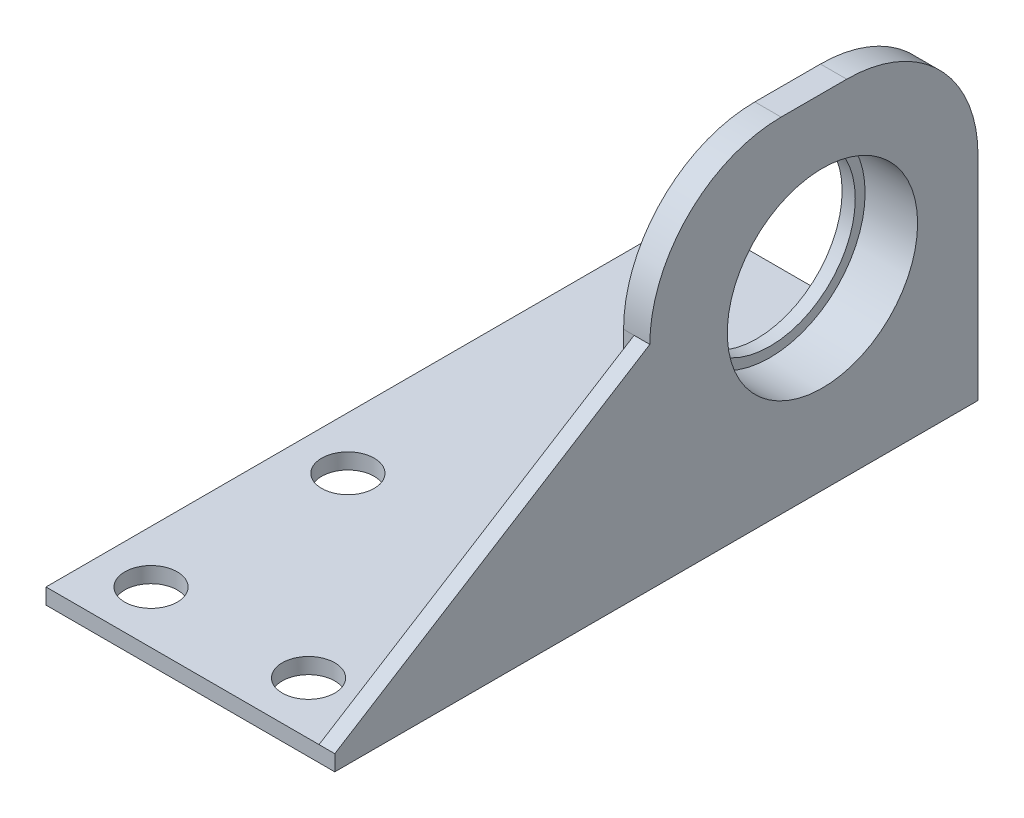
ISO-10303-21;
HEADER;
FILE_DESCRIPTION(('STEP AP214'),'2;1');
FILE_NAME('part.step','',(''),(''),'','','');
FILE_SCHEMA(('AUTOMOTIVE_DESIGN { 1 0 10303 214 1 1 1 1 }'));
ENDSEC;
DATA;
#1=APPLICATION_CONTEXT('core data for automotive mechanical design processes');
#2=APPLICATION_PROTOCOL_DEFINITION('international standard','automotive_design',2000,#1);
#3=PRODUCT_CONTEXT('',#1,'mechanical');
#4=PRODUCT('Part','Part','',(#3));
#5=PRODUCT_RELATED_PRODUCT_CATEGORY('part','',(#4));
#6=PRODUCT_DEFINITION_FORMATION('','',#4);
#7=PRODUCT_DEFINITION_CONTEXT('part definition',#1,'design');
#8=PRODUCT_DEFINITION('design','',#6,#7);
#9=PRODUCT_DEFINITION_SHAPE('','',#8);
#10=(LENGTH_UNIT() NAMED_UNIT(*) SI_UNIT(.MILLI.,.METRE.));
#11=(NAMED_UNIT(*) PLANE_ANGLE_UNIT() SI_UNIT($,.RADIAN.));
#12=(NAMED_UNIT(*) SI_UNIT($,.STERADIAN.) SOLID_ANGLE_UNIT());
#13=UNCERTAINTY_MEASURE_WITH_UNIT(LENGTH_MEASURE(1.E-05),#10,'distance_accuracy_value','');
#14=(GEOMETRIC_REPRESENTATION_CONTEXT(3) GLOBAL_UNCERTAINTY_ASSIGNED_CONTEXT((#13)) GLOBAL_UNIT_ASSIGNED_CONTEXT((#10,
#11,#12)) REPRESENTATION_CONTEXT('',''));
#15=CARTESIAN_POINT('',(0.,0.,0.));
#16=DIRECTION('',(0.,0.,1.));
#17=DIRECTION('',(1.,0.,0.));
#18=AXIS2_PLACEMENT_3D('',#15,#16,#17);
#19=CARTESIAN_POINT('',(22.,1.2,0.));
#20=DIRECTION('',(0.,-1.,0.));
#21=DIRECTION('',(0.,0.,-1.));
#22=AXIS2_PLACEMENT_3D('',#19,#20,#21);
#23=PLANE('',#22);
#24=CARTESIAN_POINT('',(16.,1.2,-4.));
#25=DIRECTION('',(0.,1.,0.));
#26=DIRECTION('',(0.,0.,-1.));
#27=AXIS2_PLACEMENT_3D('',#24,#25,#26);
#28=CIRCLE('',#27,2.);
#29=CARTESIAN_POINT('',(16.,1.2,-6.));
#30=VERTEX_POINT('',#29);
#31=EDGE_CURVE('E215',#30,#30,#28,.T.);
#32=ORIENTED_EDGE('',*,*,#31,.F.);
#33=EDGE_LOOP('',(#32));
#34=FACE_BOUND('',#33,.T.);
#35=CARTESIAN_POINT('',(4.00000000000001,1.2,-4.00000000000001));
#36=DIRECTION('',(0.,1.,0.));
#37=DIRECTION('',(0.,0.,1.));
#38=AXIS2_PLACEMENT_3D('',#35,#36,#37);
#39=CIRCLE('',#38,2.);
#40=CARTESIAN_POINT('',(4.00000000000001,1.2,-2.00000000000001));
#41=VERTEX_POINT('',#40);
#42=EDGE_CURVE('E224',#41,#41,#39,.T.);
#43=ORIENTED_EDGE('',*,*,#42,.F.);
#44=EDGE_LOOP('',(#43));
#45=FACE_BOUND('',#44,.T.);
#46=CARTESIAN_POINT('',(4.00000000000001,1.2,-19.));
#47=DIRECTION('',(0.,1.,0.));
#48=DIRECTION('',(0.,0.,-1.));
#49=AXIS2_PLACEMENT_3D('',#46,#47,#48);
#50=CIRCLE('',#49,2.);
#51=CARTESIAN_POINT('',(4.00000000000001,1.2,-21.));
#52=VERTEX_POINT('',#51);
#53=EDGE_CURVE('E216',#52,#52,#50,.T.);
#54=ORIENTED_EDGE('',*,*,#53,.F.);
#55=EDGE_LOOP('',(#54));
#56=FACE_BOUND('',#55,.T.);
#57=CARTESIAN_POINT('',(16.,1.2,-19.));
#58=DIRECTION('',(0.,1.,0.));
#59=DIRECTION('',(0.,0.,1.));
#60=AXIS2_PLACEMENT_3D('',#57,#58,#59);
#61=CIRCLE('',#60,2.);
#62=CARTESIAN_POINT('',(16.,1.2,-17.));
#63=VERTEX_POINT('',#62);
#64=EDGE_CURVE('E223',#63,#63,#61,.T.);
#65=ORIENTED_EDGE('',*,*,#64,.F.);
#66=EDGE_LOOP('',(#65));
#67=FACE_BOUND('',#66,.T.);
#68=DIRECTION('',(0.,0.,-1.));
#69=VECTOR('',#68,1.);
#70=CARTESIAN_POINT('',(20.8,1.2,-24.));
#71=LINE('',#70,#69);
#72=CARTESIAN_POINT('',(20.8,1.2,0.));
#73=VERTEX_POINT('',#72);
#74=CARTESIAN_POINT('',(20.8,1.2,-24.));
#75=VERTEX_POINT('',#74);
#76=EDGE_CURVE('E55',#73,#75,#71,.T.);
#77=ORIENTED_EDGE('',*,*,#76,.T.);
#78=DIRECTION('',(1.,0.,0.));
#79=VECTOR('',#78,1.);
#80=CARTESIAN_POINT('',(20.,1.2,-24.));
#81=LINE('',#80,#79);
#82=CARTESIAN_POINT('',(20.,1.2,-24.));
#83=VERTEX_POINT('',#82);
#84=EDGE_CURVE('E146',#83,#75,#81,.T.);
#85=ORIENTED_EDGE('',*,*,#84,.F.);
#86=DIRECTION('',(0.,0.,1.));
#87=VECTOR('',#86,1.);
#88=CARTESIAN_POINT('',(20.,1.20000000000001,-49.));
#89=LINE('',#88,#87);
#90=CARTESIAN_POINT('',(20.,1.20000000000001,-36.15));
#91=VERTEX_POINT('',#90);
#92=EDGE_CURVE('E200',#91,#83,#89,.T.);
#93=ORIENTED_EDGE('',*,*,#92,.F.);
#94=DIRECTION('',(-1.,0.,0.));
#95=VECTOR('',#94,1.);
#96=CARTESIAN_POINT('',(22.002,1.20000000000001,-36.15));
#97=LINE('',#96,#95);
#98=CARTESIAN_POINT('',(17.,1.20000000000001,-36.15));
#99=VERTEX_POINT('',#98);
#100=EDGE_CURVE('E179',#91,#99,#97,.T.);
#101=ORIENTED_EDGE('',*,*,#100,.T.);
#102=DIRECTION('',(0.,0.,1.));
#103=VECTOR('',#102,1.);
#104=CARTESIAN_POINT('',(17.,1.20000000000001,-36.15));
#105=LINE('',#104,#103);
#106=CARTESIAN_POINT('',(17.,1.20000000000001,-38.15));
#107=VERTEX_POINT('',#106);
#108=EDGE_CURVE('E175',#107,#99,#105,.T.);
#109=ORIENTED_EDGE('',*,*,#108,.F.);
#110=DIRECTION('',(-1.,0.,0.));
#111=VECTOR('',#110,1.);
#112=CARTESIAN_POINT('',(22.002,1.20000000000001,-38.15));
#113=LINE('',#112,#111);
#114=CARTESIAN_POINT('',(20.,1.20000000000001,-38.15));
#115=VERTEX_POINT('',#114);
#116=EDGE_CURVE('E169',#115,#107,#113,.T.);
#117=ORIENTED_EDGE('',*,*,#116,.F.);
#118=CARTESIAN_POINT('',(20.,1.20000000000001,-49.));
#119=VERTEX_POINT('',#118);
#120=EDGE_CURVE('E208',#119,#115,#89,.T.);
#121=ORIENTED_EDGE('',*,*,#120,.F.);
#122=DIRECTION('',(-1.,0.,0.));
#123=VECTOR('',#122,1.);
#124=CARTESIAN_POINT('',(22.,1.20000000000001,-49.));
#125=LINE('',#124,#123);
#126=CARTESIAN_POINT('',(0.,1.20000000000001,-49.));
#127=VERTEX_POINT('',#126);
#128=EDGE_CURVE('E259',#119,#127,#125,.T.);
#129=ORIENTED_EDGE('',*,*,#128,.T.);
#130=DIRECTION('',(0.,0.,1.));
#131=VECTOR('',#130,1.);
#132=CARTESIAN_POINT('',(0.,1.2,0.));
#133=LINE('',#132,#131);
#134=CARTESIAN_POINT('',(0.,1.2,0.));
#135=VERTEX_POINT('',#134);
#136=EDGE_CURVE('E244',#127,#135,#133,.T.);
#137=ORIENTED_EDGE('',*,*,#136,.T.);
#138=DIRECTION('',(-1.,0.,0.));
#139=VECTOR('',#138,1.);
#140=CARTESIAN_POINT('',(22.,1.2,0.));
#141=LINE('',#140,#139);
#142=EDGE_CURVE('E50',#73,#135,#141,.T.);
#143=ORIENTED_EDGE('',*,*,#142,.F.);
#144=EDGE_LOOP('',(#77,#85,#93,#101,#109,#117,#121,#129,#137,#143));
#145=FACE_BOUND('',#144,.T.);
#146=ADVANCED_FACE('F35',(#34,#45,#56,#67,#145),#23,.F.);
#147=CARTESIAN_POINT('',(20.,26.2,-24.));
#148=DIRECTION('',(0.,0.,-1.));
#149=DIRECTION('',(0.,1.,0.));
#150=AXIS2_PLACEMENT_3D('',#147,#148,#149);
#151=PLANE('',#150);
#152=DIRECTION('',(0.,1.,0.));
#153=VECTOR('',#152,1.);
#154=CARTESIAN_POINT('',(20.8,16.2,-24.));
#155=LINE('',#154,#153);
#156=CARTESIAN_POINT('',(20.8,16.2,-24.));
#157=VERTEX_POINT('',#156);
#158=EDGE_CURVE('E144',#75,#157,#155,.T.);
#159=ORIENTED_EDGE('',*,*,#158,.T.);
#160=DIRECTION('',(1.,0.,0.));
#161=VECTOR('',#160,1.);
#162=CARTESIAN_POINT('',(20.,16.2,-24.));
#163=LINE('',#162,#161);
#164=CARTESIAN_POINT('',(20.,16.2,-24.));
#165=VERTEX_POINT('',#164);
#166=EDGE_CURVE('E43',#157,#165,#163,.F.);
#167=ORIENTED_EDGE('',*,*,#166,.T.);
#168=DIRECTION('',(0.,-1.,0.));
#169=VECTOR('',#168,1.);
#170=CARTESIAN_POINT('',(20.,26.2,-24.));
#171=LINE('',#170,#169);
#172=EDGE_CURVE('E213',#165,#83,#171,.T.);
#173=ORIENTED_EDGE('',*,*,#172,.T.);
#174=ORIENTED_EDGE('',*,*,#84,.T.);
#175=EDGE_LOOP('',(#159,#167,#173,#174));
#176=FACE_BOUND('',#175,.T.);
#177=ADVANCED_FACE('F145',(#176),#151,.F.);
#178=CARTESIAN_POINT('',(-0.00100000000000447,14.,-37.15));
#179=DIRECTION('',(1.,0.,0.));
#180=DIRECTION('',(0.,0.,-1.));
#181=AXIS2_PLACEMENT_3D('',#178,#179,#180);
#182=CYLINDRICAL_SURFACE('',#181,7.25000000000001);
#183=CARTESIAN_POINT('',(22.,14.,-37.15));
#184=DIRECTION('',(1.,0.,0.));
#185=DIRECTION('',(0.,0.,-1.));
#186=AXIS2_PLACEMENT_3D('',#183,#184,#185);
#187=CIRCLE('',#186,7.25000000000001);
#188=CARTESIAN_POINT('',(22.,14.,-44.4));
#189=VERTEX_POINT('',#188);
#190=EDGE_CURVE('E197',#189,#189,#187,.T.);
#191=ORIENTED_EDGE('',*,*,#190,.T.);
#192=EDGE_LOOP('',(#191));
#193=FACE_BOUND('',#192,.T.);
#194=CARTESIAN_POINT('',(18.,14.,-37.15));
#195=DIRECTION('',(-1.,0.,0.));
#196=DIRECTION('',(0.,0.,1.));
#197=AXIS2_PLACEMENT_3D('',#194,#195,#196);
#198=CIRCLE('',#197,7.25000000000001);
#199=CARTESIAN_POINT('',(18.,14.,-29.9));
#200=VERTEX_POINT('',#199);
#201=EDGE_CURVE('E190',#200,#200,#198,.F.);
#202=ORIENTED_EDGE('',*,*,#201,.F.);
#203=EDGE_LOOP('',(#202));
#204=FACE_BOUND('',#203,.T.);
#205=ADVANCED_FACE('F341',(#193,#204),#182,.F.);
#206=CARTESIAN_POINT('',(20.,26.2,-49.));
#207=DIRECTION('',(1.,0.,0.));
#208=DIRECTION('',(0.,0.,-1.));
#209=AXIS2_PLACEMENT_3D('',#206,#207,#208);
#210=PLANE('',#209);
#211=DIRECTION('',(0.,0.,1.));
#212=VECTOR('',#211,1.);
#213=CARTESIAN_POINT('',(20.,26.2,-49.));
#214=LINE('',#213,#212);
#215=CARTESIAN_POINT('',(20.,26.2,-39.));
#216=VERTEX_POINT('',#215);
#217=CARTESIAN_POINT('',(20.,26.2,-34.));
#218=VERTEX_POINT('',#217);
#219=EDGE_CURVE('E201',#216,#218,#214,.T.);
#220=ORIENTED_EDGE('',*,*,#219,.F.);
#221=CARTESIAN_POINT('',(20.,16.2,-39.));
#222=DIRECTION('',(1.,0.,0.));
#223=DIRECTION('',(0.,0.,-1.));
#224=AXIS2_PLACEMENT_3D('',#221,#222,#223);
#225=CIRCLE('',#224,10.);
#226=CARTESIAN_POINT('',(20.,16.2,-49.));
#227=VERTEX_POINT('',#226);
#228=EDGE_CURVE('E275',#216,#227,#225,.F.);
#229=ORIENTED_EDGE('',*,*,#228,.T.);
#230=DIRECTION('',(0.,-1.,0.));
#231=VECTOR('',#230,1.);
#232=CARTESIAN_POINT('',(20.,26.2,-49.));
#233=LINE('',#232,#231);
#234=EDGE_CURVE('E207',#227,#119,#233,.T.);
#235=ORIENTED_EDGE('',*,*,#234,.T.);
#236=ORIENTED_EDGE('',*,*,#120,.T.);
#237=DIRECTION('',(0.,-1.,0.));
#238=VECTOR('',#237,1.);
#239=CARTESIAN_POINT('',(20.,7.49999999999999,-38.15));
#240=LINE('',#239,#238);
#241=CARTESIAN_POINT('',(20.,6.06274606680623,-38.15));
#242=VERTEX_POINT('',#241);
#243=EDGE_CURVE('E168',#242,#115,#240,.T.);
#244=ORIENTED_EDGE('',*,*,#243,.F.);
#245=CARTESIAN_POINT('',(20.,14.,-37.15));
#246=DIRECTION('',(1.,0.,0.));
#247=DIRECTION('',(0.,0.,-1.));
#248=AXIS2_PLACEMENT_3D('',#245,#246,#247);
#249=CIRCLE('',#248,8.);
#250=CARTESIAN_POINT('',(20.,6.06274606680623,-36.15));
#251=VERTEX_POINT('',#250);
#252=EDGE_CURVE('E194',#251,#242,#249,.F.);
#253=ORIENTED_EDGE('',*,*,#252,.F.);
#254=DIRECTION('',(0.,1.,0.));
#255=VECTOR('',#254,1.);
#256=CARTESIAN_POINT('',(20.,7.49999999999999,-36.15));
#257=LINE('',#256,#255);
#258=EDGE_CURVE('E161',#91,#251,#257,.T.);
#259=ORIENTED_EDGE('',*,*,#258,.F.);
#260=ORIENTED_EDGE('',*,*,#92,.T.);
#261=ORIENTED_EDGE('',*,*,#172,.F.);
#262=CARTESIAN_POINT('',(20.,16.2,-34.));
#263=DIRECTION('',(1.,0.,0.));
#264=DIRECTION('',(0.,0.,-1.));
#265=AXIS2_PLACEMENT_3D('',#262,#263,#264);
#266=CIRCLE('',#265,10.);
#267=EDGE_CURVE('E139',#165,#218,#266,.F.);
#268=ORIENTED_EDGE('',*,*,#267,.T.);
#269=EDGE_LOOP('',(#220,#229,#235,#236,#244,#253,#259,#260,#261,#268));
#270=FACE_BOUND('',#269,.T.);
#271=ADVANCED_FACE('F295',(#270),#210,.F.);
#272=CARTESIAN_POINT('',(22.,0.,0.));
#273=DIRECTION('',(0.,0.,-1.));
#274=DIRECTION('',(-1.,0.,0.));
#275=AXIS2_PLACEMENT_3D('',#272,#273,#274);
#276=PLANE('',#275);
#277=DIRECTION('',(0.,-1.,0.));
#278=VECTOR('',#277,1.);
#279=CARTESIAN_POINT('',(0.,0.,0.));
#280=LINE('',#279,#278);
#281=CARTESIAN_POINT('',(0.,0.,0.));
#282=VERTEX_POINT('',#281);
#283=EDGE_CURVE('E239',#135,#282,#280,.T.);
#284=ORIENTED_EDGE('',*,*,#283,.T.);
#285=DIRECTION('',(-1.,0.,0.));
#286=VECTOR('',#285,1.);
#287=CARTESIAN_POINT('',(22.,0.,0.));
#288=LINE('',#287,#286);
#289=CARTESIAN_POINT('',(22.,0.,0.));
#290=VERTEX_POINT('',#289);
#291=EDGE_CURVE('E264',#290,#282,#288,.T.);
#292=ORIENTED_EDGE('',*,*,#291,.F.);
#293=DIRECTION('',(0.,-1.,0.));
#294=VECTOR('',#293,1.);
#295=CARTESIAN_POINT('',(22.,0.,0.));
#296=LINE('',#295,#294);
#297=CARTESIAN_POINT('',(22.,1.2,0.));
#298=VERTEX_POINT('',#297);
#299=EDGE_CURVE('E240',#298,#290,#296,.T.);
#300=ORIENTED_EDGE('',*,*,#299,.F.);
#301=EDGE_CURVE('E257',#298,#73,#141,.T.);
#302=ORIENTED_EDGE('',*,*,#301,.T.);
#303=ORIENTED_EDGE('',*,*,#142,.T.);
#304=EDGE_LOOP('',(#284,#292,#300,#302,#303));
#305=FACE_BOUND('',#304,.T.);
#306=ADVANCED_FACE('F354',(#305),#276,.F.);
#307=CARTESIAN_POINT('',(22.,0.,0.));
#308=DIRECTION('',(0.,1.,0.));
#309=DIRECTION('',(0.,0.,1.));
#310=AXIS2_PLACEMENT_3D('',#307,#308,#309);
#311=PLANE('',#310);
#312=CARTESIAN_POINT('',(16.,0.,-4.));
#313=DIRECTION('',(0.,1.,0.));
#314=DIRECTION('',(0.,0.,1.));
#315=AXIS2_PLACEMENT_3D('',#312,#313,#314);
#316=CIRCLE('',#315,2.);
#317=CARTESIAN_POINT('',(16.,0.,-2.));
#318=VERTEX_POINT('',#317);
#319=EDGE_CURVE('E227',#318,#318,#316,.F.);
#320=ORIENTED_EDGE('',*,*,#319,.F.);
#321=EDGE_LOOP('',(#320));
#322=FACE_BOUND('',#321,.T.);
#323=CARTESIAN_POINT('',(4.00000000000001,0.,-4.00000000000001));
#324=DIRECTION('',(0.,1.,0.));
#325=DIRECTION('',(0.,0.,1.));
#326=AXIS2_PLACEMENT_3D('',#323,#324,#325);
#327=CIRCLE('',#326,2.);
#328=CARTESIAN_POINT('',(4.00000000000001,0.,-2.00000000000001));
#329=VERTEX_POINT('',#328);
#330=EDGE_CURVE('E220',#329,#329,#327,.F.);
#331=ORIENTED_EDGE('',*,*,#330,.F.);
#332=EDGE_LOOP('',(#331));
#333=FACE_BOUND('',#332,.T.);
#334=CARTESIAN_POINT('',(4.00000000000001,0.,-19.));
#335=DIRECTION('',(0.,1.,0.));
#336=DIRECTION('',(0.,0.,1.));
#337=AXIS2_PLACEMENT_3D('',#334,#335,#336);
#338=CIRCLE('',#337,2.);
#339=CARTESIAN_POINT('',(4.00000000000001,0.,-17.));
#340=VERTEX_POINT('',#339);
#341=EDGE_CURVE('E219',#340,#340,#338,.F.);
#342=ORIENTED_EDGE('',*,*,#341,.F.);
#343=EDGE_LOOP('',(#342));
#344=FACE_BOUND('',#343,.T.);
#345=CARTESIAN_POINT('',(16.,0.,-19.));
#346=DIRECTION('',(0.,1.,0.));
#347=DIRECTION('',(0.,0.,1.));
#348=AXIS2_PLACEMENT_3D('',#345,#346,#347);
#349=CIRCLE('',#348,2.);
#350=CARTESIAN_POINT('',(16.,0.,-17.));
#351=VERTEX_POINT('',#350);
#352=EDGE_CURVE('E236',#351,#351,#349,.F.);
#353=ORIENTED_EDGE('',*,*,#352,.F.);
#354=EDGE_LOOP('',(#353));
#355=FACE_BOUND('',#354,.T.);
#356=DIRECTION('',(0.,0.,-1.));
#357=VECTOR('',#356,1.);
#358=CARTESIAN_POINT('',(0.,0.,0.));
#359=LINE('',#358,#357);
#360=CARTESIAN_POINT('',(0.,0.,-49.));
#361=VERTEX_POINT('',#360);
#362=EDGE_CURVE('E251',#282,#361,#359,.T.);
#363=ORIENTED_EDGE('',*,*,#362,.T.);
#364=DIRECTION('',(-1.,0.,0.));
#365=VECTOR('',#364,1.);
#366=CARTESIAN_POINT('',(22.,0.,-49.));
#367=LINE('',#366,#365);
#368=CARTESIAN_POINT('',(22.,0.,-49.));
#369=VERTEX_POINT('',#368);
#370=EDGE_CURVE('E261',#369,#361,#367,.T.);
#371=ORIENTED_EDGE('',*,*,#370,.F.);
#372=DIRECTION('',(0.,0.,-1.));
#373=VECTOR('',#372,1.);
#374=CARTESIAN_POINT('',(22.,0.,0.));
#375=LINE('',#374,#373);
#376=EDGE_CURVE('E243',#290,#369,#375,.T.);
#377=ORIENTED_EDGE('',*,*,#376,.F.);
#378=ORIENTED_EDGE('',*,*,#291,.T.);
#379=EDGE_LOOP('',(#363,#371,#377,#378));
#380=FACE_BOUND('',#379,.T.);
#381=ADVANCED_FACE('F351',(#322,#333,#344,#355,#380),#311,.F.);
#382=CARTESIAN_POINT('',(22.,0.,-49.));
#383=DIRECTION('',(0.,0.,1.));
#384=DIRECTION('',(1.,0.,0.));
#385=AXIS2_PLACEMENT_3D('',#382,#383,#384);
#386=PLANE('',#385);
#387=ORIENTED_EDGE('',*,*,#234,.F.);
#388=DIRECTION('',(-1.,0.,0.));
#389=VECTOR('',#388,1.);
#390=CARTESIAN_POINT('',(22.,16.2,-49.));
#391=LINE('',#390,#389);
#392=CARTESIAN_POINT('',(22.,16.2,-49.));
#393=VERTEX_POINT('',#392);
#394=EDGE_CURVE('E277',#227,#393,#391,.F.);
#395=ORIENTED_EDGE('',*,*,#394,.T.);
#396=DIRECTION('',(0.,1.,0.));
#397=VECTOR('',#396,1.);
#398=CARTESIAN_POINT('',(22.,0.,-49.));
#399=LINE('',#398,#397);
#400=EDGE_CURVE('E246',#369,#393,#399,.T.);
#401=ORIENTED_EDGE('',*,*,#400,.F.);
#402=ORIENTED_EDGE('',*,*,#370,.T.);
#403=DIRECTION('',(0.,1.,0.));
#404=VECTOR('',#403,1.);
#405=CARTESIAN_POINT('',(0.,0.,-49.));
#406=LINE('',#405,#404);
#407=EDGE_CURVE('E253',#361,#127,#406,.T.);
#408=ORIENTED_EDGE('',*,*,#407,.T.);
#409=ORIENTED_EDGE('',*,*,#128,.F.);
#410=EDGE_LOOP('',(#387,#395,#401,#402,#408,#409));
#411=FACE_BOUND('',#410,.T.);
#412=ADVANCED_FACE('F299',(#411),#386,.F.);
#413=CARTESIAN_POINT('',(22.,0.,0.));
#414=DIRECTION('',(-1.,0.,0.));
#415=DIRECTION('',(0.,0.,1.));
#416=AXIS2_PLACEMENT_3D('',#413,#414,#415);
#417=PLANE('',#416);
#418=DIRECTION('',(0.,-0.52999894000318,0.847998304005088));
#419=VECTOR('',#418,1.);
#420=CARTESIAN_POINT('',(22.,1.2,0.));
#421=LINE('',#420,#419);
#422=CARTESIAN_POINT('',(22.,16.2,-24.));
#423=VERTEX_POINT('',#422);
#424=EDGE_CURVE('E156',#423,#298,#421,.T.);
#425=ORIENTED_EDGE('',*,*,#424,.T.);
#426=ORIENTED_EDGE('',*,*,#299,.T.);
#427=ORIENTED_EDGE('',*,*,#376,.T.);
#428=ORIENTED_EDGE('',*,*,#400,.T.);
#429=CARTESIAN_POINT('',(22.,16.2,-39.));
#430=DIRECTION('',(-1.,0.,0.));
#431=DIRECTION('',(0.,0.,1.));
#432=AXIS2_PLACEMENT_3D('',#429,#430,#431);
#433=CIRCLE('',#432,10.);
#434=CARTESIAN_POINT('',(22.,26.2,-39.));
#435=VERTEX_POINT('',#434);
#436=EDGE_CURVE('E142',#393,#435,#433,.F.);
#437=ORIENTED_EDGE('',*,*,#436,.T.);
#438=DIRECTION('',(0.,0.,-1.));
#439=VECTOR('',#438,1.);
#440=CARTESIAN_POINT('',(22.,26.2,-49.));
#441=LINE('',#440,#439);
#442=CARTESIAN_POINT('',(22.,26.2,-34.));
#443=VERTEX_POINT('',#442);
#444=EDGE_CURVE('E204',#443,#435,#441,.T.);
#445=ORIENTED_EDGE('',*,*,#444,.F.);
#446=CARTESIAN_POINT('',(22.,16.2,-34.));
#447=DIRECTION('',(-1.,0.,0.));
#448=DIRECTION('',(0.,0.,1.));
#449=AXIS2_PLACEMENT_3D('',#446,#447,#448);
#450=CIRCLE('',#449,10.);
#451=EDGE_CURVE('E279',#443,#423,#450,.F.);
#452=ORIENTED_EDGE('',*,*,#451,.T.);
#453=EDGE_LOOP('',(#425,#426,#427,#428,#437,#445,#452));
#454=FACE_BOUND('',#453,.T.);
#455=ORIENTED_EDGE('',*,*,#190,.F.);
#456=EDGE_LOOP('',(#455));
#457=FACE_BOUND('',#456,.T.);
#458=ADVANCED_FACE('F283',(#454,#457),#417,.F.);
#459=CARTESIAN_POINT('',(0.,0.,0.));
#460=DIRECTION('',(-1.,0.,0.));
#461=DIRECTION('',(0.,0.,1.));
#462=AXIS2_PLACEMENT_3D('',#459,#460,#461);
#463=PLANE('',#462);
#464=ORIENTED_EDGE('',*,*,#283,.F.);
#465=ORIENTED_EDGE('',*,*,#136,.F.);
#466=ORIENTED_EDGE('',*,*,#407,.F.);
#467=ORIENTED_EDGE('',*,*,#362,.F.);
#468=EDGE_LOOP('',(#464,#465,#466,#467));
#469=FACE_BOUND('',#468,.T.);
#470=ADVANCED_FACE('F347',(#469),#463,.T.);
#471=CARTESIAN_POINT('',(16.,-0.000999999999999916,-19.));
#472=DIRECTION('',(0.,1.,0.));
#473=DIRECTION('',(0.,0.,1.));
#474=AXIS2_PLACEMENT_3D('',#471,#472,#473);
#475=CYLINDRICAL_SURFACE('',#474,2.);
#476=ORIENTED_EDGE('',*,*,#64,.T.);
#477=EDGE_LOOP('',(#476));
#478=FACE_BOUND('',#477,.T.);
#479=ORIENTED_EDGE('',*,*,#352,.T.);
#480=EDGE_LOOP('',(#479));
#481=FACE_BOUND('',#480,.T.);
#482=ADVANCED_FACE('F367',(#478,#481),#475,.F.);
#483=CARTESIAN_POINT('',(4.00000000000001,-0.000999999999999916,-19.));
#484=DIRECTION('',(0.,1.,0.));
#485=DIRECTION('',(0.,0.,1.));
#486=AXIS2_PLACEMENT_3D('',#483,#484,#485);
#487=CYLINDRICAL_SURFACE('',#486,2.);
#488=ORIENTED_EDGE('',*,*,#53,.T.);
#489=EDGE_LOOP('',(#488));
#490=FACE_BOUND('',#489,.T.);
#491=ORIENTED_EDGE('',*,*,#341,.T.);
#492=EDGE_LOOP('',(#491));
#493=FACE_BOUND('',#492,.T.);
#494=ADVANCED_FACE('F372',(#490,#493),#487,.F.);
#495=CARTESIAN_POINT('',(4.00000000000001,-0.000999999999999916,-4.00000000000001));
#496=DIRECTION('',(0.,1.,0.));
#497=DIRECTION('',(0.,0.,1.));
#498=AXIS2_PLACEMENT_3D('',#495,#496,#497);
#499=CYLINDRICAL_SURFACE('',#498,2.);
#500=ORIENTED_EDGE('',*,*,#42,.T.);
#501=EDGE_LOOP('',(#500));
#502=FACE_BOUND('',#501,.T.);
#503=ORIENTED_EDGE('',*,*,#330,.T.);
#504=EDGE_LOOP('',(#503));
#505=FACE_BOUND('',#504,.T.);
#506=ADVANCED_FACE('F381',(#502,#505),#499,.F.);
#507=CARTESIAN_POINT('',(16.,-0.000999999999999916,-4.));
#508=DIRECTION('',(0.,1.,0.));
#509=DIRECTION('',(0.,0.,1.));
#510=AXIS2_PLACEMENT_3D('',#507,#508,#509);
#511=CYLINDRICAL_SURFACE('',#510,2.);
#512=ORIENTED_EDGE('',*,*,#31,.T.);
#513=EDGE_LOOP('',(#512));
#514=FACE_BOUND('',#513,.T.);
#515=ORIENTED_EDGE('',*,*,#319,.T.);
#516=EDGE_LOOP('',(#515));
#517=FACE_BOUND('',#516,.T.);
#518=ADVANCED_FACE('F378',(#514,#517),#511,.F.);
#519=CARTESIAN_POINT('',(0.,26.2,0.));
#520=DIRECTION('',(0.,1.,0.));
#521=DIRECTION('',(0.,0.,1.));
#522=AXIS2_PLACEMENT_3D('',#519,#520,#521);
#523=PLANE('',#522);
#524=ORIENTED_EDGE('',*,*,#444,.T.);
#525=DIRECTION('',(-1.,0.,0.));
#526=VECTOR('',#525,1.);
#527=CARTESIAN_POINT('',(20.,26.2,-39.));
#528=LINE('',#527,#526);
#529=EDGE_CURVE('E271',#435,#216,#528,.T.);
#530=ORIENTED_EDGE('',*,*,#529,.T.);
#531=ORIENTED_EDGE('',*,*,#219,.T.);
#532=DIRECTION('',(1.,0.,0.));
#533=VECTOR('',#532,1.);
#534=CARTESIAN_POINT('',(22.,26.2,-34.));
#535=LINE('',#534,#533);
#536=EDGE_CURVE('E193',#218,#443,#535,.T.);
#537=ORIENTED_EDGE('',*,*,#536,.T.);
#538=EDGE_LOOP('',(#524,#530,#531,#537));
#539=FACE_BOUND('',#538,.T.);
#540=ADVANCED_FACE('F290',(#539),#523,.T.);
#541=CARTESIAN_POINT('',(17.,14.,-37.15));
#542=DIRECTION('',(-1.,0.,0.));
#543=DIRECTION('',(0.,0.,1.));
#544=AXIS2_PLACEMENT_3D('',#541,#542,#543);
#545=PLANE('',#544);
#546=CARTESIAN_POINT('',(17.,14.,-37.15));
#547=DIRECTION('',(-1.,0.,0.));
#548=DIRECTION('',(0.,0.,1.));
#549=AXIS2_PLACEMENT_3D('',#546,#547,#548);
#550=CIRCLE('',#549,8.);
#551=CARTESIAN_POINT('',(17.,6.06274606680623,-36.15));
#552=VERTEX_POINT('',#551);
#553=CARTESIAN_POINT('',(17.,6.06274606680623,-38.15));
#554=VERTEX_POINT('',#553);
#555=EDGE_CURVE('E187',#552,#554,#550,.T.);
#556=ORIENTED_EDGE('',*,*,#555,.T.);
#557=DIRECTION('',(0.,-1.,0.));
#558=VECTOR('',#557,1.);
#559=CARTESIAN_POINT('',(17.,7.49999999999999,-38.15));
#560=LINE('',#559,#558);
#561=EDGE_CURVE('E177',#554,#107,#560,.T.);
#562=ORIENTED_EDGE('',*,*,#561,.T.);
#563=ORIENTED_EDGE('',*,*,#108,.T.);
#564=DIRECTION('',(0.,1.,0.));
#565=VECTOR('',#564,1.);
#566=CARTESIAN_POINT('',(17.,7.49999999999999,-36.15));
#567=LINE('',#566,#565);
#568=EDGE_CURVE('E172',#99,#552,#567,.T.);
#569=ORIENTED_EDGE('',*,*,#568,.T.);
#570=EDGE_LOOP('',(#556,#562,#563,#569));
#571=FACE_BOUND('',#570,.T.);
#572=CARTESIAN_POINT('',(17.,14.,-37.15));
#573=DIRECTION('',(-1.,0.,0.));
#574=DIRECTION('',(0.,0.,1.));
#575=AXIS2_PLACEMENT_3D('',#572,#573,#574);
#576=CIRCLE('',#575,6.50000000000001);
#577=CARTESIAN_POINT('',(17.,14.,-30.65));
#578=VERTEX_POINT('',#577);
#579=EDGE_CURVE('E174',#578,#578,#576,.T.);
#580=ORIENTED_EDGE('',*,*,#579,.F.);
#581=EDGE_LOOP('',(#580));
#582=FACE_BOUND('',#581,.T.);
#583=ADVANCED_FACE('F320',(#571,#582),#545,.T.);
#584=CARTESIAN_POINT('',(17.,14.,-37.15));
#585=DIRECTION('',(1.,0.,0.));
#586=DIRECTION('',(0.,0.,-1.));
#587=AXIS2_PLACEMENT_3D('',#584,#585,#586);
#588=CYLINDRICAL_SURFACE('',#587,8.);
#589=ORIENTED_EDGE('',*,*,#555,.F.);
#590=DIRECTION('',(1.,0.,0.));
#591=VECTOR('',#590,1.);
#592=CARTESIAN_POINT('',(17.,6.06274606680623,-36.15));
#593=LINE('',#592,#591);
#594=EDGE_CURVE('E158',#251,#552,#593,.F.);
#595=ORIENTED_EDGE('',*,*,#594,.F.);
#596=ORIENTED_EDGE('',*,*,#252,.T.);
#597=DIRECTION('',(1.,0.,0.));
#598=VECTOR('',#597,1.);
#599=CARTESIAN_POINT('',(17.,6.06274606680623,-38.15));
#600=LINE('',#599,#598);
#601=EDGE_CURVE('E167',#554,#242,#600,.T.);
#602=ORIENTED_EDGE('',*,*,#601,.F.);
#603=EDGE_LOOP('',(#589,#595,#596,#602));
#604=FACE_BOUND('',#603,.T.);
#605=ADVANCED_FACE('F313',(#604),#588,.T.);
#606=CARTESIAN_POINT('',(18.,14.,-37.15));
#607=DIRECTION('',(-1.,0.,0.));
#608=DIRECTION('',(0.,0.,1.));
#609=AXIS2_PLACEMENT_3D('',#606,#607,#608);
#610=PLANE('',#609);
#611=CARTESIAN_POINT('',(18.,14.,-37.15));
#612=DIRECTION('',(-1.,0.,0.));
#613=DIRECTION('',(0.,0.,1.));
#614=AXIS2_PLACEMENT_3D('',#611,#612,#613);
#615=CIRCLE('',#614,6.50000000000001);
#616=CARTESIAN_POINT('',(18.,14.,-30.65));
#617=VERTEX_POINT('',#616);
#618=EDGE_CURVE('E184',#617,#617,#615,.T.);
#619=ORIENTED_EDGE('',*,*,#618,.T.);
#620=EDGE_LOOP('',(#619));
#621=FACE_BOUND('',#620,.T.);
#622=ORIENTED_EDGE('',*,*,#201,.T.);
#623=EDGE_LOOP('',(#622));
#624=FACE_BOUND('',#623,.T.);
#625=ADVANCED_FACE('F333',(#621,#624),#610,.F.);
#626=CARTESIAN_POINT('',(18.,14.,-37.15));
#627=DIRECTION('',(-1.,0.,0.));
#628=DIRECTION('',(0.,0.,1.));
#629=AXIS2_PLACEMENT_3D('',#626,#627,#628);
#630=CYLINDRICAL_SURFACE('',#629,6.50000000000001);
#631=ORIENTED_EDGE('',*,*,#618,.F.);
#632=EDGE_LOOP('',(#631));
#633=FACE_BOUND('',#632,.T.);
#634=ORIENTED_EDGE('',*,*,#579,.T.);
#635=EDGE_LOOP('',(#634));
#636=FACE_BOUND('',#635,.T.);
#637=ADVANCED_FACE('F325',(#633,#636),#630,.F.);
#638=CARTESIAN_POINT('',(22.002,7.49999999999999,-36.15));
#639=DIRECTION('',(0.,0.,1.));
#640=DIRECTION('',(1.,0.,0.));
#641=AXIS2_PLACEMENT_3D('',#638,#639,#640);
#642=PLANE('',#641);
#643=ORIENTED_EDGE('',*,*,#258,.T.);
#644=ORIENTED_EDGE('',*,*,#594,.T.);
#645=ORIENTED_EDGE('',*,*,#568,.F.);
#646=ORIENTED_EDGE('',*,*,#100,.F.);
#647=EDGE_LOOP('',(#643,#644,#645,#646));
#648=FACE_BOUND('',#647,.T.);
#649=ADVANCED_FACE('F316',(#648),#642,.T.);
#650=CARTESIAN_POINT('',(22.002,7.49999999999999,-38.15));
#651=DIRECTION('',(0.,0.,-1.));
#652=DIRECTION('',(-1.,0.,0.));
#653=AXIS2_PLACEMENT_3D('',#650,#651,#652);
#654=PLANE('',#653);
#655=ORIENTED_EDGE('',*,*,#561,.F.);
#656=ORIENTED_EDGE('',*,*,#601,.T.);
#657=ORIENTED_EDGE('',*,*,#243,.T.);
#658=ORIENTED_EDGE('',*,*,#116,.T.);
#659=EDGE_LOOP('',(#655,#656,#657,#658));
#660=FACE_BOUND('',#659,.T.);
#661=ADVANCED_FACE('F322',(#660),#654,.T.);
#662=CARTESIAN_POINT('',(0.,16.2,-39.));
#663=DIRECTION('',(1.,0.,0.));
#664=DIRECTION('',(0.,0.,-1.));
#665=AXIS2_PLACEMENT_3D('',#662,#663,#664);
#666=CYLINDRICAL_SURFACE('',#665,10.);
#667=ORIENTED_EDGE('',*,*,#436,.F.);
#668=ORIENTED_EDGE('',*,*,#394,.F.);
#669=ORIENTED_EDGE('',*,*,#228,.F.);
#670=ORIENTED_EDGE('',*,*,#529,.F.);
#671=EDGE_LOOP('',(#667,#668,#669,#670));
#672=FACE_BOUND('',#671,.T.);
#673=ADVANCED_FACE('F292',(#672),#666,.T.);
#674=CARTESIAN_POINT('',(0.,16.2,-34.));
#675=DIRECTION('',(-1.,0.,0.));
#676=DIRECTION('',(0.,0.,1.));
#677=AXIS2_PLACEMENT_3D('',#674,#675,#676);
#678=CYLINDRICAL_SURFACE('',#677,10.);
#679=ORIENTED_EDGE('',*,*,#267,.F.);
#680=ORIENTED_EDGE('',*,*,#166,.F.);
#681=EDGE_CURVE('E11',#423,#157,#163,.F.);
#682=ORIENTED_EDGE('',*,*,#681,.F.);
#683=ORIENTED_EDGE('',*,*,#451,.F.);
#684=ORIENTED_EDGE('',*,*,#536,.F.);
#685=EDGE_LOOP('',(#679,#680,#682,#683,#684));
#686=FACE_BOUND('',#685,.T.);
#687=ADVANCED_FACE('F37',(#686),#678,.T.);
#688=CARTESIAN_POINT('',(20.8,1.2,0.));
#689=DIRECTION('',(0.,0.847998304005088,0.52999894000318));
#690=DIRECTION('',(0.,-0.52999894000318,0.847998304005088));
#691=AXIS2_PLACEMENT_3D('',#688,#689,#690);
#692=PLANE('',#691);
#693=ORIENTED_EDGE('',*,*,#424,.F.);
#694=ORIENTED_EDGE('',*,*,#681,.T.);
#695=DIRECTION('',(0.,-0.52999894000318,0.847998304005088));
#696=VECTOR('',#695,1.);
#697=CARTESIAN_POINT('',(20.8,1.2,0.));
#698=LINE('',#697,#696);
#699=EDGE_CURVE('E149',#157,#73,#698,.T.);
#700=ORIENTED_EDGE('',*,*,#699,.T.);
#701=ORIENTED_EDGE('',*,*,#301,.F.);
#702=EDGE_LOOP('',(#693,#694,#700,#701));
#703=FACE_BOUND('',#702,.T.);
#704=ADVANCED_FACE('F153',(#703),#692,.T.);
#705=CARTESIAN_POINT('',(20.8,0.,0.));
#706=DIRECTION('',(1.,0.,0.));
#707=DIRECTION('',(0.,0.,-1.));
#708=AXIS2_PLACEMENT_3D('',#705,#706,#707);
#709=PLANE('',#708);
#710=ORIENTED_EDGE('',*,*,#76,.F.);
#711=ORIENTED_EDGE('',*,*,#699,.F.);
#712=ORIENTED_EDGE('',*,*,#158,.F.);
#713=EDGE_LOOP('',(#710,#711,#712));
#714=FACE_BOUND('',#713,.T.);
#715=ADVANCED_FACE('F157',(#714),#709,.F.);
#716=CLOSED_SHELL('',(#146,#177,#205,#271,#306,#381,#412,#458,#470,#482,#494,#506,#518,#540,
#583,#605,#625,#637,#649,#661,#673,#687,#704,#715));
#717=MANIFOLD_SOLID_BREP('B2',#716);
#718=ADVANCED_BREP_SHAPE_REPRESENTATION('',(#18,#717),#14);
#719=SHAPE_DEFINITION_REPRESENTATION(#9,#718);
ENDSEC;
END-ISO-10303-21;
